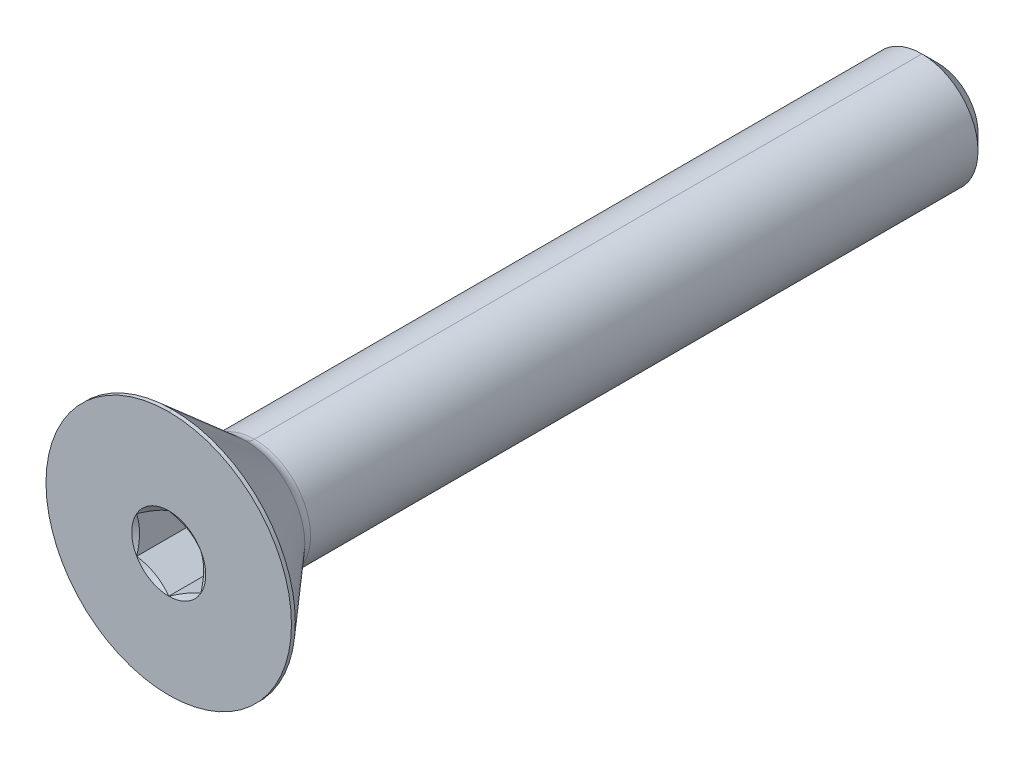
ISO-10303-21;
HEADER;
FILE_DESCRIPTION(('STEP AP214'),'2;1');
FILE_NAME('part.step','',(''),(''),'','','');
FILE_SCHEMA(('AUTOMOTIVE_DESIGN { 1 0 10303 214 1 1 1 1 }'));
ENDSEC;
DATA;
#1=APPLICATION_CONTEXT('core data for automotive mechanical design processes');
#2=APPLICATION_PROTOCOL_DEFINITION('international standard','automotive_design',2000,#1);
#3=PRODUCT_CONTEXT('',#1,'mechanical');
#4=PRODUCT('Part','Part','',(#3));
#5=PRODUCT_RELATED_PRODUCT_CATEGORY('part','',(#4));
#6=PRODUCT_DEFINITION_FORMATION('','',#4);
#7=PRODUCT_DEFINITION_CONTEXT('part definition',#1,'design');
#8=PRODUCT_DEFINITION('design','',#6,#7);
#9=PRODUCT_DEFINITION_SHAPE('','',#8);
#10=(LENGTH_UNIT() NAMED_UNIT(*) SI_UNIT(.MILLI.,.METRE.));
#11=(NAMED_UNIT(*) PLANE_ANGLE_UNIT() SI_UNIT($,.RADIAN.));
#12=(NAMED_UNIT(*) SI_UNIT($,.STERADIAN.) SOLID_ANGLE_UNIT());
#13=UNCERTAINTY_MEASURE_WITH_UNIT(LENGTH_MEASURE(1.E-05),#10,'distance_accuracy_value','');
#14=(GEOMETRIC_REPRESENTATION_CONTEXT(3) GLOBAL_UNCERTAINTY_ASSIGNED_CONTEXT((#13)) GLOBAL_UNIT_ASSIGNED_CONTEXT((#10,
#11,#12)) REPRESENTATION_CONTEXT('',''));
#15=CARTESIAN_POINT('',(0.,0.,0.));
#16=DIRECTION('',(0.,0.,1.));
#17=DIRECTION('',(1.,0.,0.));
#18=AXIS2_PLACEMENT_3D('',#15,#16,#17);
#19=CARTESIAN_POINT('',(0.,0.,0.));
#20=DIRECTION('',(0.,0.,1.));
#21=DIRECTION('',(1.,0.,0.));
#22=AXIS2_PLACEMENT_3D('',#19,#20,#21);
#23=CONICAL_SURFACE('',#22,1.3748153285078,1.0471975511966);
#24=CARTESIAN_POINT('',(1.190625,0.,-0.1063423357461));
#25=CARTESIAN_POINT('',(1.190625,0.169795795298559,-0.1063423357461));
#26=CARTESIAN_POINT('',(1.190625,0.348705391530209,-0.0774671553296856));
#27=CARTESIAN_POINT('',(1.190625,0.508257609779709,-0.0517161660880056));
#28=CARTESIAN_POINT('',(1.190625,0.687407664253899,0.));
#29=B_SPLINE_CURVE_WITH_KNOTS('',2,(#24,#25,#26,#27,#28),.UNSPECIFIED.,.F.,.F.,(3,2,3),(0.,0.5,
1.),.UNSPECIFIED.);
#30=CARTESIAN_POINT('',(1.190625,0.,-0.106342335746101));
#31=VERTEX_POINT('',#30);
#32=CARTESIAN_POINT('',(1.190625,0.687407664253899,0.));
#33=VERTEX_POINT('',#32);
#34=EDGE_CURVE('E44',#31,#33,#29,.T.);
#35=ORIENTED_EDGE('',*,*,#34,.F.);
#36=DIRECTION('',(0.86602540378444,0.,0.5));
#37=VECTOR('',#36,1.);
#38=CARTESIAN_POINT('',(1.3748153285078,0.,0.));
#39=LINE('',#38,#37);
#40=CARTESIAN_POINT('',(1.3748153285078,0.,0.));
#41=VERTEX_POINT('',#40);
#42=EDGE_CURVE('E11',#31,#41,#39,.T.);
#43=ORIENTED_EDGE('',*,*,#42,.T.);
#44=CARTESIAN_POINT('',(0.,0.,0.));
#45=DIRECTION('',(0.,0.,1.));
#46=DIRECTION('',(1.,0.,0.));
#47=AXIS2_PLACEMENT_3D('',#44,#45,#46);
#48=CIRCLE('',#47,1.3748153285078);
#49=EDGE_CURVE('E30',#41,#33,#48,.T.);
#50=ORIENTED_EDGE('',*,*,#49,.T.);
#51=EDGE_LOOP('',(#35,#43,#50));
#52=FACE_BOUND('',#51,.T.);
#53=ADVANCED_FACE('F17',(#52),#23,.F.);
#54=CARTESIAN_POINT('',(0.,0.,0.));
#55=DIRECTION('',(0.,0.,1.));
#56=DIRECTION('',(0.,-1.,0.));
#57=AXIS2_PLACEMENT_3D('',#54,#55,#56);
#58=CYLINDRICAL_SURFACE('',#57,4.5593);
#59=CARTESIAN_POINT('',(0.,0.,-0.14224));
#60=DIRECTION('',(0.,0.,1.));
#61=DIRECTION('',(0.,-1.,0.));
#62=AXIS2_PLACEMENT_3D('',#59,#60,#61);
#63=CIRCLE('',#62,4.5593);
#64=CARTESIAN_POINT('',(0.,-4.5593,-0.142239999999998));
#65=VERTEX_POINT('',#64);
#66=CARTESIAN_POINT('',(0.,4.5593,-0.14224));
#67=VERTEX_POINT('',#66);
#68=EDGE_CURVE('E489',#65,#67,#63,.T.);
#69=ORIENTED_EDGE('',*,*,#68,.T.);
#70=DIRECTION('',(0.,0.,1.));
#71=VECTOR('',#70,1.);
#72=CARTESIAN_POINT('',(0.,4.5593,0.));
#73=LINE('',#72,#71);
#74=CARTESIAN_POINT('',(0.,4.5593,0.));
#75=VERTEX_POINT('',#74);
#76=EDGE_CURVE('E476',#67,#75,#73,.T.);
#77=ORIENTED_EDGE('',*,*,#76,.T.);
#78=CARTESIAN_POINT('',(0.,0.,0.));
#79=DIRECTION('',(0.,0.,1.));
#80=DIRECTION('',(0.,-1.,0.));
#81=AXIS2_PLACEMENT_3D('',#78,#79,#80);
#82=CIRCLE('',#81,4.5593);
#83=CARTESIAN_POINT('',(0.,-4.5593,0.));
#84=VERTEX_POINT('',#83);
#85=EDGE_CURVE('E423',#84,#75,#82,.T.);
#86=ORIENTED_EDGE('',*,*,#85,.F.);
#87=DIRECTION('',(0.,0.,1.));
#88=VECTOR('',#87,1.);
#89=CARTESIAN_POINT('',(0.,-4.5593,0.));
#90=LINE('',#89,#88);
#91=EDGE_CURVE('E427',#65,#84,#90,.T.);
#92=ORIENTED_EDGE('',*,*,#91,.F.);
#93=EDGE_LOOP('',(#69,#77,#86,#92));
#94=FACE_BOUND('',#93,.T.);
#95=ADVANCED_FACE('F19',(#94),#58,.T.);
#96=CARTESIAN_POINT('',(0.,0.,-2.8448));
#97=DIRECTION('',(0.,0.,1.));
#98=DIRECTION('',(0.,-1.,0.));
#99=AXIS2_PLACEMENT_3D('',#96,#97,#98);
#100=CONICAL_SURFACE('',#99,2.21000043384737,0.715584993317676);
#101=CARTESIAN_POINT('',(0.,0.,-2.8448));
#102=DIRECTION('',(0.,0.,1.));
#103=DIRECTION('',(0.,-1.,0.));
#104=AXIS2_PLACEMENT_3D('',#101,#102,#103);
#105=CIRCLE('',#104,2.21000043384737);
#106=CARTESIAN_POINT('',(0.,-2.21000043384737,-2.8448));
#107=VERTEX_POINT('',#106);
#108=CARTESIAN_POINT('',(0.,2.21000043384737,-2.8448));
#109=VERTEX_POINT('',#108);
#110=EDGE_CURVE('E472',#107,#109,#105,.T.);
#111=ORIENTED_EDGE('',*,*,#110,.T.);
#112=DIRECTION('',(0.,0.656059028990509,0.754709580222771));
#113=VECTOR('',#112,1.);
#114=CARTESIAN_POINT('',(0.,2.21000043384737,-2.8448));
#115=LINE('',#114,#113);
#116=EDGE_CURVE('E432',#109,#67,#115,.T.);
#117=ORIENTED_EDGE('',*,*,#116,.T.);
#118=ORIENTED_EDGE('',*,*,#68,.F.);
#119=DIRECTION('',(0.,-0.656059028990508,0.754709580222771));
#120=VECTOR('',#119,1.);
#121=CARTESIAN_POINT('',(0.,-2.21000043384737,-2.8448));
#122=LINE('',#121,#120);
#123=EDGE_CURVE('E420',#107,#65,#122,.T.);
#124=ORIENTED_EDGE('',*,*,#123,.F.);
#125=EDGE_LOOP('',(#111,#117,#118,#124));
#126=FACE_BOUND('',#125,.T.);
#127=ADVANCED_FACE('F222',(#126),#100,.T.);
#128=CARTESIAN_POINT('',(0.,0.,-3.18501301440498));
#129=DIRECTION('',(0.,0.,1.));
#130=DIRECTION('',(0.,-1.,0.));
#131=AXIS2_PLACEMENT_3D('',#128,#129,#130);
#132=TOROIDAL_SURFACE('',#131,2.60137073734429,0.518570737344285);
#133=CARTESIAN_POINT('',(0.,0.,-2.8448));
#134=DIRECTION('',(0.,0.,1.));
#135=DIRECTION('',(0.,-1.,0.));
#136=AXIS2_PLACEMENT_3D('',#133,#134,#135);
#137=CIRCLE('',#136,2.21000043384737);
#138=EDGE_CURVE('E465',#109,#107,#137,.T.);
#139=ORIENTED_EDGE('',*,*,#138,.F.);
#140=CARTESIAN_POINT('',(0.,2.60137073734429,-3.18501301440498));
#141=DIRECTION('',(1.,0.,0.));
#142=DIRECTION('',(0.,1.,0.));
#143=AXIS2_PLACEMENT_3D('',#140,#141,#142);
#144=CIRCLE('',#143,0.518570737344285);
#145=CARTESIAN_POINT('',(0.,2.0828,-3.18501301440498));
#146=VERTEX_POINT('',#145);
#147=EDGE_CURVE('E428',#109,#146,#144,.T.);
#148=ORIENTED_EDGE('',*,*,#147,.T.);
#149=CARTESIAN_POINT('',(0.,0.,-3.18501301440498));
#150=DIRECTION('',(0.,0.,1.));
#151=DIRECTION('',(0.,-1.,0.));
#152=AXIS2_PLACEMENT_3D('',#149,#150,#151);
#153=CIRCLE('',#152,2.0828);
#154=CARTESIAN_POINT('',(0.,-2.0828,-3.18501301440498));
#155=VERTEX_POINT('',#154);
#156=EDGE_CURVE('E433',#146,#155,#153,.T.);
#157=ORIENTED_EDGE('',*,*,#156,.T.);
#158=CARTESIAN_POINT('',(0.,-2.60137073734429,-3.18501301440498));
#159=DIRECTION('',(-1.,0.,0.));
#160=DIRECTION('',(0.,0.,1.));
#161=AXIS2_PLACEMENT_3D('',#158,#159,#160);
#162=CIRCLE('',#161,0.518570737344285);
#163=EDGE_CURVE('E437',#107,#155,#162,.T.);
#164=ORIENTED_EDGE('',*,*,#163,.F.);
#165=EDGE_LOOP('',(#139,#148,#157,#164));
#166=FACE_BOUND('',#165,.T.);
#167=ADVANCED_FACE('F225',(#166),#132,.F.);
#168=CARTESIAN_POINT('',(0.,0.,-28.575));
#169=DIRECTION('',(0.,0.,1.));
#170=DIRECTION('',(0.,-1.,0.));
#171=AXIS2_PLACEMENT_3D('',#168,#169,#170);
#172=CONICAL_SURFACE('',#171,1.4874875,0.785398163397447);
#173=CARTESIAN_POINT('',(0.,0.,-28.575));
#174=DIRECTION('',(0.,0.,-1.));
#175=DIRECTION('',(0.,1.,0.));
#176=AXIS2_PLACEMENT_3D('',#173,#174,#175);
#177=CIRCLE('',#176,1.4874875);
#178=CARTESIAN_POINT('',(0.,1.4874875,-28.575));
#179=VERTEX_POINT('',#178);
#180=CARTESIAN_POINT('',(0.,-1.4874875,-28.575));
#181=VERTEX_POINT('',#180);
#182=EDGE_CURVE('E436',#179,#181,#177,.T.);
#183=ORIENTED_EDGE('',*,*,#182,.F.);
#184=DIRECTION('',(0.,0.707106781186547,0.707106781186549));
#185=VECTOR('',#184,1.);
#186=CARTESIAN_POINT('',(0.,1.4874875,-28.575));
#187=LINE('',#186,#185);
#188=CARTESIAN_POINT('',(0.,2.0828,-27.9796875));
#189=VERTEX_POINT('',#188);
#190=EDGE_CURVE('E481',#179,#189,#187,.T.);
#191=ORIENTED_EDGE('',*,*,#190,.T.);
#192=CARTESIAN_POINT('',(0.,0.,-27.9796875));
#193=DIRECTION('',(0.,0.,1.));
#194=DIRECTION('',(0.,1.,0.));
#195=AXIS2_PLACEMENT_3D('',#192,#193,#194);
#196=CIRCLE('',#195,2.0828);
#197=CARTESIAN_POINT('',(0.,-2.0828,-27.9796875));
#198=VERTEX_POINT('',#197);
#199=EDGE_CURVE('E521',#198,#189,#196,.T.);
#200=ORIENTED_EDGE('',*,*,#199,.F.);
#201=DIRECTION('',(0.,-0.707106781186547,0.707106781186549));
#202=VECTOR('',#201,1.);
#203=CARTESIAN_POINT('',(0.,-1.4874875,-28.575));
#204=LINE('',#203,#202);
#205=EDGE_CURVE('E434',#181,#198,#204,.T.);
#206=ORIENTED_EDGE('',*,*,#205,.F.);
#207=EDGE_LOOP('',(#183,#191,#200,#206));
#208=FACE_BOUND('',#207,.T.);
#209=ADVANCED_FACE('F546',(#208),#172,.T.);
#210=CARTESIAN_POINT('',(0.,0.,-28.575));
#211=DIRECTION('',(0.,0.,-1.));
#212=DIRECTION('',(0.,1.,0.));
#213=AXIS2_PLACEMENT_3D('',#210,#211,#212);
#214=CYLINDRICAL_SURFACE('',#213,2.0828);
#215=CARTESIAN_POINT('',(0.,0.,-3.18501301440498));
#216=DIRECTION('',(0.,0.,1.));
#217=DIRECTION('',(0.,-1.,0.));
#218=AXIS2_PLACEMENT_3D('',#215,#216,#217);
#219=CIRCLE('',#218,2.0828);
#220=EDGE_CURVE('E456',#155,#146,#219,.T.);
#221=ORIENTED_EDGE('',*,*,#220,.F.);
#222=DIRECTION('',(0.,0.,-1.));
#223=VECTOR('',#222,1.);
#224=CARTESIAN_POINT('',(0.,-2.0828,-28.575));
#225=LINE('',#224,#223);
#226=EDGE_CURVE('E519',#155,#198,#225,.T.);
#227=ORIENTED_EDGE('',*,*,#226,.T.);
#228=ORIENTED_EDGE('',*,*,#199,.T.);
#229=DIRECTION('',(0.,0.,-1.));
#230=VECTOR('',#229,1.);
#231=CARTESIAN_POINT('',(0.,2.0828,-28.575));
#232=LINE('',#231,#230);
#233=EDGE_CURVE('E525',#146,#189,#232,.T.);
#234=ORIENTED_EDGE('',*,*,#233,.F.);
#235=EDGE_LOOP('',(#221,#227,#228,#234));
#236=FACE_BOUND('',#235,.T.);
#237=ADVANCED_FACE('F220',(#236),#214,.T.);
#238=CARTESIAN_POINT('',(0.,0.,-28.575));
#239=DIRECTION('',(0.,0.,-1.));
#240=DIRECTION('',(0.,1.,0.));
#241=AXIS2_PLACEMENT_3D('',#238,#239,#240);
#242=CYLINDRICAL_SURFACE('',#241,2.0828);
#243=ORIENTED_EDGE('',*,*,#226,.F.);
#244=ORIENTED_EDGE('',*,*,#156,.F.);
#245=ORIENTED_EDGE('',*,*,#233,.T.);
#246=CARTESIAN_POINT('',(0.,0.,-27.9796875));
#247=DIRECTION('',(0.,0.,1.));
#248=DIRECTION('',(0.,1.,0.));
#249=AXIS2_PLACEMENT_3D('',#246,#247,#248);
#250=CIRCLE('',#249,2.0828);
#251=EDGE_CURVE('E516',#189,#198,#250,.T.);
#252=ORIENTED_EDGE('',*,*,#251,.T.);
#253=EDGE_LOOP('',(#243,#244,#245,#252));
#254=FACE_BOUND('',#253,.T.);
#255=ADVANCED_FACE('F287',(#254),#242,.T.);
#256=CARTESIAN_POINT('',(0.,-2.0828,-28.575));
#257=DIRECTION('',(0.,0.,-1.));
#258=DIRECTION('',(-1.,0.,0.));
#259=AXIS2_PLACEMENT_3D('',#256,#257,#258);
#260=PLANE('',#259);
#261=CARTESIAN_POINT('',(0.,0.,-28.575));
#262=DIRECTION('',(0.,0.,-1.));
#263=DIRECTION('',(0.,1.,0.));
#264=AXIS2_PLACEMENT_3D('',#261,#262,#263);
#265=CIRCLE('',#264,1.4874875);
#266=EDGE_CURVE('E453',#181,#179,#265,.T.);
#267=ORIENTED_EDGE('',*,*,#266,.T.);
#268=ORIENTED_EDGE('',*,*,#182,.T.);
#269=EDGE_LOOP('',(#267,#268));
#270=FACE_BOUND('',#269,.T.);
#271=ADVANCED_FACE('F285',(#270),#260,.T.);
#272=CARTESIAN_POINT('',(0.,0.,-28.575));
#273=DIRECTION('',(0.,0.,1.));
#274=DIRECTION('',(0.,-1.,0.));
#275=AXIS2_PLACEMENT_3D('',#272,#273,#274);
#276=CONICAL_SURFACE('',#275,1.4874875,0.785398163397447);
#277=ORIENTED_EDGE('',*,*,#190,.F.);
#278=ORIENTED_EDGE('',*,*,#266,.F.);
#279=ORIENTED_EDGE('',*,*,#205,.T.);
#280=ORIENTED_EDGE('',*,*,#251,.F.);
#281=EDGE_LOOP('',(#277,#278,#279,#280));
#282=FACE_BOUND('',#281,.T.);
#283=ADVANCED_FACE('F281',(#282),#276,.T.);
#284=CARTESIAN_POINT('',(0.,0.,-3.18501301440498));
#285=DIRECTION('',(0.,0.,1.));
#286=DIRECTION('',(0.,-1.,0.));
#287=AXIS2_PLACEMENT_3D('',#284,#285,#286);
#288=TOROIDAL_SURFACE('',#287,2.60137073734429,0.518570737344285);
#289=ORIENTED_EDGE('',*,*,#147,.F.);
#290=ORIENTED_EDGE('',*,*,#110,.F.);
#291=ORIENTED_EDGE('',*,*,#163,.T.);
#292=ORIENTED_EDGE('',*,*,#220,.T.);
#293=EDGE_LOOP('',(#289,#290,#291,#292));
#294=FACE_BOUND('',#293,.T.);
#295=ADVANCED_FACE('F284',(#294),#288,.F.);
#296=CARTESIAN_POINT('',(0.,0.,-2.8448));
#297=DIRECTION('',(0.,0.,1.));
#298=DIRECTION('',(0.,-1.,0.));
#299=AXIS2_PLACEMENT_3D('',#296,#297,#298);
#300=CONICAL_SURFACE('',#299,2.21000043384737,0.715584993317676);
#301=ORIENTED_EDGE('',*,*,#116,.F.);
#302=ORIENTED_EDGE('',*,*,#138,.T.);
#303=ORIENTED_EDGE('',*,*,#123,.T.);
#304=CARTESIAN_POINT('',(0.,0.,-0.14224));
#305=DIRECTION('',(0.,0.,1.));
#306=DIRECTION('',(0.,-1.,0.));
#307=AXIS2_PLACEMENT_3D('',#304,#305,#306);
#308=CIRCLE('',#307,4.5593);
#309=EDGE_CURVE('E499',#67,#65,#308,.T.);
#310=ORIENTED_EDGE('',*,*,#309,.F.);
#311=EDGE_LOOP('',(#301,#302,#303,#310));
#312=FACE_BOUND('',#311,.T.);
#313=ADVANCED_FACE('F352',(#312),#300,.T.);
#314=CARTESIAN_POINT('',(0.,0.,0.));
#315=DIRECTION('',(0.,0.,1.));
#316=DIRECTION('',(0.,-1.,0.));
#317=AXIS2_PLACEMENT_3D('',#314,#315,#316);
#318=CYLINDRICAL_SURFACE('',#317,4.5593);
#319=ORIENTED_EDGE('',*,*,#76,.F.);
#320=ORIENTED_EDGE('',*,*,#309,.T.);
#321=ORIENTED_EDGE('',*,*,#91,.T.);
#322=CARTESIAN_POINT('',(0.,0.,0.));
#323=DIRECTION('',(0.,0.,1.));
#324=DIRECTION('',(0.,-1.,0.));
#325=AXIS2_PLACEMENT_3D('',#322,#323,#324);
#326=CIRCLE('',#325,4.5593);
#327=EDGE_CURVE('E329',#75,#84,#326,.T.);
#328=ORIENTED_EDGE('',*,*,#327,.F.);
#329=EDGE_LOOP('',(#319,#320,#321,#328));
#330=FACE_BOUND('',#329,.T.);
#331=ADVANCED_FACE('F497',(#330),#318,.T.);
#332=CARTESIAN_POINT('',(0.,-2.0828,0.));
#333=DIRECTION('',(0.,0.,1.));
#334=DIRECTION('',(1.,0.,0.));
#335=AXIS2_PLACEMENT_3D('',#332,#333,#334);
#336=PLANE('',#335);
#337=ORIENTED_EDGE('',*,*,#85,.T.);
#338=ORIENTED_EDGE('',*,*,#327,.T.);
#339=EDGE_LOOP('',(#337,#338));
#340=FACE_BOUND('',#339,.T.);
#341=CARTESIAN_POINT('',(0.,0.,0.));
#342=DIRECTION('',(0.,0.,1.));
#343=DIRECTION('',(1.,0.,0.));
#344=AXIS2_PLACEMENT_3D('',#341,#342,#343);
#345=CIRCLE('',#344,1.3748153285078);
#346=CARTESIAN_POINT('',(0.,-1.3748153285078,0.));
#347=VERTEX_POINT('',#346);
#348=CARTESIAN_POINT('',(1.190625,-0.687407664253899,0.));
#349=VERTEX_POINT('',#348);
#350=EDGE_CURVE('E252',#347,#349,#345,.T.);
#351=ORIENTED_EDGE('',*,*,#350,.F.);
#352=CARTESIAN_POINT('',(0.,0.,0.));
#353=DIRECTION('',(0.,0.,1.));
#354=DIRECTION('',(1.,0.,0.));
#355=AXIS2_PLACEMENT_3D('',#352,#353,#354);
#356=CIRCLE('',#355,1.3748153285078);
#357=CARTESIAN_POINT('',(-1.190625,-0.687407664253899,0.));
#358=VERTEX_POINT('',#357);
#359=EDGE_CURVE('E243',#358,#347,#356,.T.);
#360=ORIENTED_EDGE('',*,*,#359,.F.);
#361=CARTESIAN_POINT('',(0.,0.,0.));
#362=DIRECTION('',(0.,0.,1.));
#363=DIRECTION('',(1.,0.,0.));
#364=AXIS2_PLACEMENT_3D('',#361,#362,#363);
#365=CIRCLE('',#364,1.3748153285078);
#366=CARTESIAN_POINT('',(-1.190625,0.6874076642539,0.));
#367=VERTEX_POINT('',#366);
#368=EDGE_CURVE('E251',#367,#358,#365,.T.);
#369=ORIENTED_EDGE('',*,*,#368,.F.);
#370=CARTESIAN_POINT('',(0.,0.,0.));
#371=DIRECTION('',(0.,0.,1.));
#372=DIRECTION('',(1.,0.,0.));
#373=AXIS2_PLACEMENT_3D('',#370,#371,#372);
#374=CIRCLE('',#373,1.3748153285078);
#375=CARTESIAN_POINT('',(0.,1.3748153285078,0.));
#376=VERTEX_POINT('',#375);
#377=EDGE_CURVE('E319',#376,#367,#374,.T.);
#378=ORIENTED_EDGE('',*,*,#377,.F.);
#379=CARTESIAN_POINT('',(0.,0.,0.));
#380=DIRECTION('',(0.,0.,1.));
#381=DIRECTION('',(1.,0.,0.));
#382=AXIS2_PLACEMENT_3D('',#379,#380,#381);
#383=CIRCLE('',#382,1.3748153285078);
#384=EDGE_CURVE('E184',#33,#376,#383,.T.);
#385=ORIENTED_EDGE('',*,*,#384,.F.);
#386=ORIENTED_EDGE('',*,*,#49,.F.);
#387=CARTESIAN_POINT('',(0.,0.,0.));
#388=DIRECTION('',(0.,0.,1.));
#389=DIRECTION('',(1.,0.,0.));
#390=AXIS2_PLACEMENT_3D('',#387,#388,#389);
#391=CIRCLE('',#390,1.3748153285078);
#392=EDGE_CURVE('E335',#349,#41,#391,.T.);
#393=ORIENTED_EDGE('',*,*,#392,.F.);
#394=EDGE_LOOP('',(#351,#360,#369,#378,#385,#386,#393));
#395=FACE_BOUND('',#394,.T.);
#396=ADVANCED_FACE('F350',(#340,#395),#336,.T.);
#397=CARTESIAN_POINT('',(0.,0.,0.));
#398=DIRECTION('',(0.,0.,1.));
#399=DIRECTION('',(1.,0.,0.));
#400=AXIS2_PLACEMENT_3D('',#397,#398,#399);
#401=CONICAL_SURFACE('',#400,1.3748153285078,1.0471975511966);
#402=ORIENTED_EDGE('',*,*,#377,.T.);
#403=CARTESIAN_POINT('',(0.,1.3748153285078,0.));
#404=CARTESIAN_POINT('',(-0.318153817071982,1.19112913657758,-0.10605127236235));
#405=CARTESIAN_POINT('',(-0.594177696341051,1.03176667557882,-0.106341919438405));
#406=CARTESIAN_POINT('',(-0.870725644963858,0.872101642997603,-0.10663311834797));
#407=CARTESIAN_POINT('',(-1.190625,0.6874076642539,0.));
#408=B_SPLINE_CURVE_WITH_KNOTS('',2,(#403,#404,#405,#406,#407),.UNSPECIFIED.,.F.,.F.,(3,2,3),
(0.,0.5,1.),.UNSPECIFIED.);
#409=EDGE_CURVE('E313',#376,#367,#408,.T.);
#410=ORIENTED_EDGE('',*,*,#409,.F.);
#411=EDGE_LOOP('',(#402,#410));
#412=FACE_BOUND('',#411,.T.);
#413=ADVANCED_FACE('F232',(#412),#401,.F.);
#414=CARTESIAN_POINT('',(0.,0.,0.));
#415=DIRECTION('',(0.,0.,1.));
#416=DIRECTION('',(1.,0.,0.));
#417=AXIS2_PLACEMENT_3D('',#414,#415,#416);
#418=CONICAL_SURFACE('',#417,1.3748153285078,1.0471975511966);
#419=ORIENTED_EDGE('',*,*,#368,.T.);
#420=CARTESIAN_POINT('',(-1.190625,0.6874076642539,0.));
#421=CARTESIAN_POINT('',(-1.190625,0.319400313936409,-0.106234571384785));
#422=CARTESIAN_POINT('',(-1.190625,0.000161758586471892,-0.106342329402015));
#423=CARTESIAN_POINT('',(-1.190625,-0.318654238589435,-0.106449944786));
#424=CARTESIAN_POINT('',(-1.190625,-0.687407664253899,0.));
#425=B_SPLINE_CURVE_WITH_KNOTS('',2,(#420,#421,#422,#423,#424),.UNSPECIFIED.,.F.,.F.,(3,2,3),
(0.,0.5,1.),.UNSPECIFIED.);
#426=EDGE_CURVE('E259',#367,#358,#425,.T.);
#427=ORIENTED_EDGE('',*,*,#426,.F.);
#428=EDGE_LOOP('',(#419,#427));
#429=FACE_BOUND('',#428,.T.);
#430=ADVANCED_FACE('F227',(#429),#418,.F.);
#431=CARTESIAN_POINT('',(0.,0.,0.));
#432=DIRECTION('',(0.,0.,1.));
#433=DIRECTION('',(1.,0.,0.));
#434=AXIS2_PLACEMENT_3D('',#431,#432,#433);
#435=CONICAL_SURFACE('',#434,1.3748153285078,1.0471975511966);
#436=ORIENTED_EDGE('',*,*,#359,.T.);
#437=CARTESIAN_POINT('',(-1.190625,-0.687407664253899,0.));
#438=CARTESIAN_POINT('',(-0.872471182927829,-0.871093856184224,-0.106051272362414));
#439=CARTESIAN_POINT('',(-0.596447303658948,-1.03045631718288,-0.106341919438404));
#440=CARTESIAN_POINT('',(-0.319899355035951,-1.1901213497642,-0.106633118347904));
#441=CARTESIAN_POINT('',(0.,-1.3748153285078,0.));
#442=B_SPLINE_CURVE_WITH_KNOTS('',2,(#437,#438,#439,#440,#441),.UNSPECIFIED.,.F.,.F.,(3,2,3),
(0.,0.5,1.),.UNSPECIFIED.);
#443=EDGE_CURVE('E86',#358,#347,#442,.T.);
#444=ORIENTED_EDGE('',*,*,#443,.F.);
#445=EDGE_LOOP('',(#436,#444));
#446=FACE_BOUND('',#445,.T.);
#447=ADVANCED_FACE('F231',(#446),#435,.F.);
#448=CARTESIAN_POINT('',(0.,0.,0.));
#449=DIRECTION('',(0.,0.,1.));
#450=DIRECTION('',(1.,0.,0.));
#451=AXIS2_PLACEMENT_3D('',#448,#449,#450);
#452=CONICAL_SURFACE('',#451,1.3748153285078,1.0471975511966);
#453=ORIENTED_EDGE('',*,*,#350,.T.);
#454=CARTESIAN_POINT('',(0.,-1.3748153285078,0.));
#455=CARTESIAN_POINT('',(0.318153817071981,-1.19112913657758,-0.10605127236235));
#456=CARTESIAN_POINT('',(0.594177696341052,-1.03176667557882,-0.106341919438405));
#457=CARTESIAN_POINT('',(0.870725644963858,-0.872101642997602,-0.10663311834797));
#458=CARTESIAN_POINT('',(1.190625,-0.687407664253898,0.));
#459=B_SPLINE_CURVE_WITH_KNOTS('',2,(#454,#455,#456,#457,#458),.UNSPECIFIED.,.F.,.F.,(3,2,3),
(0.,0.5,1.),.UNSPECIFIED.);
#460=EDGE_CURVE('E69',#347,#349,#459,.T.);
#461=ORIENTED_EDGE('',*,*,#460,.F.);
#462=EDGE_LOOP('',(#453,#461));
#463=FACE_BOUND('',#462,.T.);
#464=ADVANCED_FACE('F401',(#463),#452,.F.);
#465=CARTESIAN_POINT('',(0.,0.,0.));
#466=DIRECTION('',(0.,0.,1.));
#467=DIRECTION('',(1.,0.,0.));
#468=AXIS2_PLACEMENT_3D('',#465,#466,#467);
#469=CONICAL_SURFACE('',#468,1.3748153285078,1.0471975511966);
#470=ORIENTED_EDGE('',*,*,#42,.F.);
#471=CARTESIAN_POINT('',(1.190625,-0.687407664253898,0.));
#472=CARTESIAN_POINT('',(1.190625,-0.319027007238349,-0.1063423357461));
#473=CARTESIAN_POINT('',(1.190625,0.,-0.1063423357461));
#474=B_SPLINE_CURVE_WITH_KNOTS('',2,(#471,#472,#473),.UNSPECIFIED.,.F.,.F.,(3,3),(0.,1.),.UNSPECIFIED.);
#475=EDGE_CURVE('E199',#349,#31,#474,.T.);
#476=ORIENTED_EDGE('',*,*,#475,.F.);
#477=ORIENTED_EDGE('',*,*,#392,.T.);
#478=EDGE_LOOP('',(#470,#476,#477));
#479=FACE_BOUND('',#478,.T.);
#480=ADVANCED_FACE('F395',(#479),#469,.F.);
#481=CARTESIAN_POINT('',(0.,0.,0.));
#482=DIRECTION('',(0.,0.,1.));
#483=DIRECTION('',(1.,0.,0.));
#484=AXIS2_PLACEMENT_3D('',#481,#482,#483);
#485=CONICAL_SURFACE('',#484,1.3748153285078,1.0471975511966);
#486=ORIENTED_EDGE('',*,*,#384,.T.);
#487=CARTESIAN_POINT('',(1.190625,0.687407664253898,0.));
#488=CARTESIAN_POINT('',(0.87247118292783,0.871093856184223,-0.106051272362415));
#489=CARTESIAN_POINT('',(0.596447303658948,1.03045631718288,-0.106341919438405));
#490=CARTESIAN_POINT('',(0.319899355035951,1.1901213497642,-0.106633118347905));
#491=CARTESIAN_POINT('',(0.,1.3748153285078,0.));
#492=B_SPLINE_CURVE_WITH_KNOTS('',2,(#487,#488,#489,#490,#491),.UNSPECIFIED.,.F.,.F.,(3,2,3),
(0.,0.5,1.),.UNSPECIFIED.);
#493=EDGE_CURVE('E192',#33,#376,#492,.T.);
#494=ORIENTED_EDGE('',*,*,#493,.F.);
#495=EDGE_LOOP('',(#486,#494));
#496=FACE_BOUND('',#495,.T.);
#497=ADVANCED_FACE('F356',(#496),#485,.F.);
#498=CARTESIAN_POINT('',(0.,1.3748153285078,-1.99136));
#499=DIRECTION('',(0.,0.,1.));
#500=DIRECTION('',(1.,0.,0.));
#501=AXIS2_PLACEMENT_3D('',#498,#499,#500);
#502=PLANE('',#501);
#503=DIRECTION('',(-0.866025403784439,0.5,0.));
#504=VECTOR('',#503,1.);
#505=CARTESIAN_POINT('',(1.190625,0.687407664253898,-1.99136));
#506=LINE('',#505,#504);
#507=CARTESIAN_POINT('',(1.190625,0.687407664253898,-1.99136));
#508=VERTEX_POINT('',#507);
#509=CARTESIAN_POINT('',(0.,1.3748153285078,-1.99136));
#510=VERTEX_POINT('',#509);
#511=EDGE_CURVE('E169',#508,#510,#506,.T.);
#512=ORIENTED_EDGE('',*,*,#511,.T.);
#513=DIRECTION('',(-0.866025403784439,-0.5,0.));
#514=VECTOR('',#513,1.);
#515=CARTESIAN_POINT('',(0.,1.3748153285078,-1.99136));
#516=LINE('',#515,#514);
#517=CARTESIAN_POINT('',(-1.190625,0.687407664253899,-1.99136));
#518=VERTEX_POINT('',#517);
#519=EDGE_CURVE('E185',#510,#518,#516,.T.);
#520=ORIENTED_EDGE('',*,*,#519,.T.);
#521=DIRECTION('',(0.,-1.,0.));
#522=VECTOR('',#521,1.);
#523=CARTESIAN_POINT('',(-1.190625,0.687407664253899,-1.99136));
#524=LINE('',#523,#522);
#525=CARTESIAN_POINT('',(-1.190625,-0.687407664253899,-1.99136));
#526=VERTEX_POINT('',#525);
#527=EDGE_CURVE('E412',#518,#526,#524,.T.);
#528=ORIENTED_EDGE('',*,*,#527,.T.);
#529=DIRECTION('',(0.866025403784439,-0.5,0.));
#530=VECTOR('',#529,1.);
#531=CARTESIAN_POINT('',(-1.190625,-0.687407664253899,-1.99136));
#532=LINE('',#531,#530);
#533=CARTESIAN_POINT('',(0.,-1.3748153285078,-1.99136));
#534=VERTEX_POINT('',#533);
#535=EDGE_CURVE('E417',#526,#534,#532,.T.);
#536=ORIENTED_EDGE('',*,*,#535,.T.);
#537=DIRECTION('',(0.866025403784439,0.5,0.));
#538=VECTOR('',#537,1.);
#539=CARTESIAN_POINT('',(0.,-1.3748153285078,-1.99136));
#540=LINE('',#539,#538);
#541=CARTESIAN_POINT('',(1.190625,-0.687407664253898,-1.99136));
#542=VERTEX_POINT('',#541);
#543=EDGE_CURVE('E172',#534,#542,#540,.T.);
#544=ORIENTED_EDGE('',*,*,#543,.T.);
#545=DIRECTION('',(0.,1.,0.));
#546=VECTOR('',#545,1.);
#547=CARTESIAN_POINT('',(1.190625,-0.687407664253898,-1.99136));
#548=LINE('',#547,#546);
#549=EDGE_CURVE('E159',#542,#508,#548,.T.);
#550=ORIENTED_EDGE('',*,*,#549,.T.);
#551=EDGE_LOOP('',(#512,#520,#528,#536,#544,#550));
#552=FACE_BOUND('',#551,.T.);
#553=ADVANCED_FACE('F167',(#552),#502,.T.);
#554=CARTESIAN_POINT('',(0.,1.3748153285078,-1.99136));
#555=DIRECTION('',(-0.5,0.866025403784439,0.));
#556=DIRECTION('',(0.,0.,1.));
#557=AXIS2_PLACEMENT_3D('',#554,#555,#556);
#558=PLANE('',#557);
#559=DIRECTION('',(0.,0.,1.));
#560=VECTOR('',#559,1.);
#561=CARTESIAN_POINT('',(0.,1.3748153285078,-1.99136));
#562=LINE('',#561,#560);
#563=EDGE_CURVE('E175',#510,#376,#562,.T.);
#564=ORIENTED_EDGE('',*,*,#563,.T.);
#565=ORIENTED_EDGE('',*,*,#409,.T.);
#566=DIRECTION('',(0.,0.,1.));
#567=VECTOR('',#566,1.);
#568=CARTESIAN_POINT('',(-1.190625,0.687407664253899,-1.99136));
#569=LINE('',#568,#567);
#570=EDGE_CURVE('E310',#518,#367,#569,.T.);
#571=ORIENTED_EDGE('',*,*,#570,.F.);
#572=ORIENTED_EDGE('',*,*,#519,.F.);
#573=EDGE_LOOP('',(#564,#565,#571,#572));
#574=FACE_BOUND('',#573,.T.);
#575=ADVANCED_FACE('F234',(#574),#558,.F.);
#576=CARTESIAN_POINT('',(-1.190625,0.687407664253899,-1.99136));
#577=DIRECTION('',(-1.,0.,0.));
#578=DIRECTION('',(0.,1.,0.));
#579=AXIS2_PLACEMENT_3D('',#576,#577,#578);
#580=PLANE('',#579);
#581=ORIENTED_EDGE('',*,*,#570,.T.);
#582=ORIENTED_EDGE('',*,*,#426,.T.);
#583=DIRECTION('',(0.,0.,1.));
#584=VECTOR('',#583,1.);
#585=CARTESIAN_POINT('',(-1.190625,-0.687407664253899,-1.99136));
#586=LINE('',#585,#584);
#587=EDGE_CURVE('E255',#526,#358,#586,.T.);
#588=ORIENTED_EDGE('',*,*,#587,.F.);
#589=ORIENTED_EDGE('',*,*,#527,.F.);
#590=EDGE_LOOP('',(#581,#582,#588,#589));
#591=FACE_BOUND('',#590,.T.);
#592=ADVANCED_FACE('F280',(#591),#580,.F.);
#593=CARTESIAN_POINT('',(-1.190625,-0.687407664253899,-1.99136));
#594=DIRECTION('',(-0.5,-0.866025403784439,0.));
#595=DIRECTION('',(-0.866025403784439,0.5,0.));
#596=AXIS2_PLACEMENT_3D('',#593,#594,#595);
#597=PLANE('',#596);
#598=ORIENTED_EDGE('',*,*,#587,.T.);
#599=ORIENTED_EDGE('',*,*,#443,.T.);
#600=DIRECTION('',(0.,0.,1.));
#601=VECTOR('',#600,1.);
#602=CARTESIAN_POINT('',(0.,-1.3748153285078,-1.99136));
#603=LINE('',#602,#601);
#604=EDGE_CURVE('E573',#534,#347,#603,.T.);
#605=ORIENTED_EDGE('',*,*,#604,.F.);
#606=ORIENTED_EDGE('',*,*,#535,.F.);
#607=EDGE_LOOP('',(#598,#599,#605,#606));
#608=FACE_BOUND('',#607,.T.);
#609=ADVANCED_FACE('F270',(#608),#597,.F.);
#610=CARTESIAN_POINT('',(0.,-1.3748153285078,-1.99136));
#611=DIRECTION('',(0.5,-0.866025403784439,0.));
#612=DIRECTION('',(0.,0.,-1.));
#613=AXIS2_PLACEMENT_3D('',#610,#611,#612);
#614=PLANE('',#613);
#615=ORIENTED_EDGE('',*,*,#604,.T.);
#616=ORIENTED_EDGE('',*,*,#460,.T.);
#617=DIRECTION('',(0.,0.,1.));
#618=VECTOR('',#617,1.);
#619=CARTESIAN_POINT('',(1.190625,-0.687407664253898,-1.99136));
#620=LINE('',#619,#618);
#621=EDGE_CURVE('E569',#542,#349,#620,.T.);
#622=ORIENTED_EDGE('',*,*,#621,.F.);
#623=ORIENTED_EDGE('',*,*,#543,.F.);
#624=EDGE_LOOP('',(#615,#616,#622,#623));
#625=FACE_BOUND('',#624,.T.);
#626=ADVANCED_FACE('F279',(#625),#614,.F.);
#627=CARTESIAN_POINT('',(1.190625,-0.687407664253898,-1.99136));
#628=DIRECTION('',(1.,0.,0.));
#629=DIRECTION('',(0.,1.,0.));
#630=AXIS2_PLACEMENT_3D('',#627,#628,#629);
#631=PLANE('',#630);
#632=ORIENTED_EDGE('',*,*,#621,.T.);
#633=ORIENTED_EDGE('',*,*,#475,.T.);
#634=ORIENTED_EDGE('',*,*,#34,.T.);
#635=DIRECTION('',(0.,0.,1.));
#636=VECTOR('',#635,1.);
#637=CARTESIAN_POINT('',(1.190625,0.687407664253898,-1.99136));
#638=LINE('',#637,#636);
#639=EDGE_CURVE('E181',#508,#33,#638,.T.);
#640=ORIENTED_EDGE('',*,*,#639,.F.);
#641=ORIENTED_EDGE('',*,*,#549,.F.);
#642=EDGE_LOOP('',(#632,#633,#634,#640,#641));
#643=FACE_BOUND('',#642,.T.);
#644=ADVANCED_FACE('F187',(#643),#631,.F.);
#645=CARTESIAN_POINT('',(1.190625,0.687407664253898,-1.99136));
#646=DIRECTION('',(0.5,0.866025403784439,0.));
#647=DIRECTION('',(0.,0.,-1.));
#648=AXIS2_PLACEMENT_3D('',#645,#646,#647);
#649=PLANE('',#648);
#650=ORIENTED_EDGE('',*,*,#639,.T.);
#651=ORIENTED_EDGE('',*,*,#493,.T.);
#652=ORIENTED_EDGE('',*,*,#563,.F.);
#653=ORIENTED_EDGE('',*,*,#511,.F.);
#654=EDGE_LOOP('',(#650,#651,#652,#653));
#655=FACE_BOUND('',#654,.T.);
#656=ADVANCED_FACE('F179',(#655),#649,.F.);
#657=CLOSED_SHELL('',(#53,#95,#127,#167,#209,#237,#255,#271,#283,#295,#313,#331,#396,#413,#430,
#447,#464,#480,#497,#553,#575,#592,#609,#626,#644,#656));
#658=MANIFOLD_SOLID_BREP('B1',#657);
#659=ADVANCED_BREP_SHAPE_REPRESENTATION('',(#18,#658),#14);
#660=SHAPE_DEFINITION_REPRESENTATION(#9,#659);
ENDSEC;
END-ISO-10303-21;
